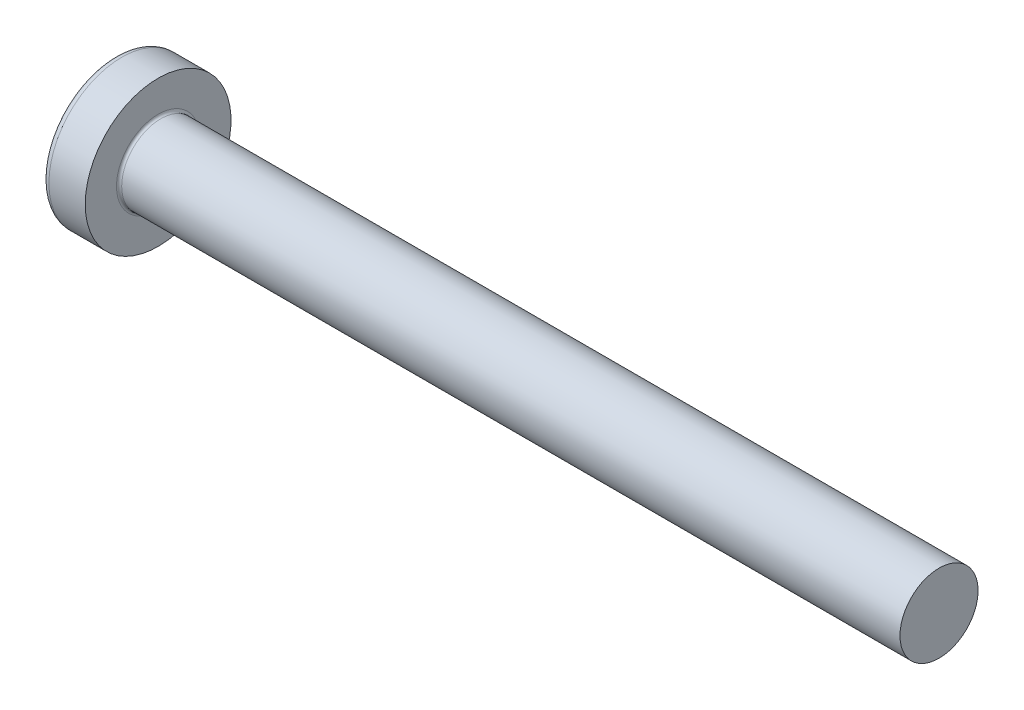
ISO-10303-21;
HEADER;
FILE_DESCRIPTION(('STEP AP214'),'2;1');
FILE_NAME('part.step','',(''),(''),'','','');
FILE_SCHEMA(('AUTOMOTIVE_DESIGN { 1 0 10303 214 1 1 1 1 }'));
ENDSEC;
DATA;
#1=APPLICATION_CONTEXT('core data for automotive mechanical design processes');
#2=APPLICATION_PROTOCOL_DEFINITION('international standard','automotive_design',2000,#1);
#3=PRODUCT_CONTEXT('',#1,'mechanical');
#4=PRODUCT('Part','Part','',(#3));
#5=PRODUCT_RELATED_PRODUCT_CATEGORY('part','',(#4));
#6=PRODUCT_DEFINITION_FORMATION('','',#4);
#7=PRODUCT_DEFINITION_CONTEXT('part definition',#1,'design');
#8=PRODUCT_DEFINITION('design','',#6,#7);
#9=PRODUCT_DEFINITION_SHAPE('','',#8);
#10=(LENGTH_UNIT() NAMED_UNIT(*) SI_UNIT(.MILLI.,.METRE.));
#11=(NAMED_UNIT(*) PLANE_ANGLE_UNIT() SI_UNIT($,.RADIAN.));
#12=(NAMED_UNIT(*) SI_UNIT($,.STERADIAN.) SOLID_ANGLE_UNIT());
#13=UNCERTAINTY_MEASURE_WITH_UNIT(LENGTH_MEASURE(1.E-05),#10,'distance_accuracy_value','');
#14=(GEOMETRIC_REPRESENTATION_CONTEXT(3) GLOBAL_UNCERTAINTY_ASSIGNED_CONTEXT((#13)) GLOBAL_UNIT_ASSIGNED_CONTEXT((#10,
#11,#12)) REPRESENTATION_CONTEXT('',''));
#15=CARTESIAN_POINT('',(0.,0.,0.));
#16=DIRECTION('',(0.,0.,1.));
#17=DIRECTION('',(1.,0.,0.));
#18=AXIS2_PLACEMENT_3D('',#15,#16,#17);
#19=CARTESIAN_POINT('',(5.,0.,0.));
#20=DIRECTION('',(-1.,0.,0.));
#21=DIRECTION('',(0.,1.,0.));
#22=AXIS2_PLACEMENT_3D('',#19,#20,#21);
#23=SPHERICAL_SURFACE('',#22,5.);
#24=CARTESIAN_POINT('',(0.775371598933733,0.,0.));
#25=DIRECTION('',(-1.,0.,0.));
#26=DIRECTION('',(0.,0.,1.));
#27=AXIS2_PLACEMENT_3D('',#24,#25,#26);
#28=CIRCLE('',#27,2.67441860465116);
#29=CARTESIAN_POINT('',(0.775371598933733,0.,2.67441860465116));
#30=VERTEX_POINT('',#29);
#31=EDGE_CURVE('E238',#30,#30,#28,.T.);
#32=ORIENTED_EDGE('',*,*,#31,.T.);
#33=EDGE_LOOP('',(#32));
#34=FACE_BOUND('',#33,.T.);
#35=CARTESIAN_POINT('',(0.0457951200896417,0.,0.));
#36=DIRECTION('',(1.,0.,0.));
#37=DIRECTION('',(0.,0.,-1.));
#38=AXIS2_PLACEMENT_3D('',#35,#36,#37);
#39=CIRCLE('',#38,0.675169614150692);
#40=CARTESIAN_POINT('',(0.0457951200896426,-0.369999999999998,-0.564760133040918));
#41=VERTEX_POINT('',#40);
#42=CARTESIAN_POINT('',(0.0457951200896417,-0.564760133040915,-0.37));
#43=VERTEX_POINT('',#42);
#44=EDGE_CURVE('E374',#41,#43,#39,.F.);
#45=ORIENTED_EDGE('',*,*,#44,.F.);
#46=CARTESIAN_POINT('',(5.,-0.37,0.));
#47=DIRECTION('',(0.,1.,0.));
#48=DIRECTION('',(0.,0.,1.));
#49=AXIS2_PLACEMENT_3D('',#46,#47,#48);
#50=CIRCLE('',#49,4.98629120689917);
#51=CARTESIAN_POINT('',(0.187869734228639,-0.369999999999995,-1.30633162146802));
#52=VERTEX_POINT('',#51);
#53=EDGE_CURVE('E300',#52,#41,#50,.T.);
#54=ORIENTED_EDGE('',*,*,#53,.F.);
#55=CARTESIAN_POINT('',(4.56358262530798,0.,0.875317983305919));
#56=DIRECTION('',(0.446197753347436,0.,-0.894934391398443));
#57=DIRECTION('',(-0.894934391398443,0.,-0.446197753347436));
#58=AXIS2_PLACEMENT_3D('',#55,#56,#57);
#59=CIRCLE('',#58,4.90340272700175);
#60=CARTESIAN_POINT('',(0.18786973422864,0.370000000000005,-1.30633162146802));
#61=VERTEX_POINT('',#60);
#62=EDGE_CURVE('E272',#52,#61,#59,.T.);
#63=ORIENTED_EDGE('',*,*,#62,.T.);
#64=CARTESIAN_POINT('',(5.,0.37,0.));
#65=DIRECTION('',(0.,-1.,0.));
#66=DIRECTION('',(0.,0.,-1.));
#67=AXIS2_PLACEMENT_3D('',#64,#65,#66);
#68=CIRCLE('',#67,4.98629120689917);
#69=CARTESIAN_POINT('',(0.0457951200896425,0.370000000000002,-0.564760133040916));
#70=VERTEX_POINT('',#69);
#71=EDGE_CURVE('E327',#70,#61,#68,.T.);
#72=ORIENTED_EDGE('',*,*,#71,.F.);
#73=CARTESIAN_POINT('',(0.0457951200896417,0.564760133040916,-0.37));
#74=VERTEX_POINT('',#73);
#75=EDGE_CURVE('E393',#74,#70,#39,.F.);
#76=ORIENTED_EDGE('',*,*,#75,.F.);
#77=CARTESIAN_POINT('',(5.,0.,-0.37));
#78=DIRECTION('',(0.,0.,1.));
#79=DIRECTION('',(1.,0.,0.));
#80=AXIS2_PLACEMENT_3D('',#77,#78,#79);
#81=CIRCLE('',#80,4.98629120689917);
#82=CARTESIAN_POINT('',(0.18786973422864,1.30633162146802,-0.37));
#83=VERTEX_POINT('',#82);
#84=EDGE_CURVE('E266',#83,#74,#81,.T.);
#85=ORIENTED_EDGE('',*,*,#84,.F.);
#86=CARTESIAN_POINT('',(4.56358262530798,-0.87531798330592,0.));
#87=DIRECTION('',(0.446197753347436,0.894934391398443,0.));
#88=DIRECTION('',(-0.894934391398442,0.446197753347436,0.));
#89=AXIS2_PLACEMENT_3D('',#86,#87,#88);
#90=CIRCLE('',#89,4.90340272700175);
#91=CARTESIAN_POINT('',(0.18786973422864,1.30633162146802,0.37));
#92=VERTEX_POINT('',#91);
#93=EDGE_CURVE('E269',#83,#92,#90,.T.);
#94=ORIENTED_EDGE('',*,*,#93,.T.);
#95=CARTESIAN_POINT('',(5.,0.,0.37));
#96=DIRECTION('',(0.,0.,-1.));
#97=DIRECTION('',(0.,1.,0.));
#98=AXIS2_PLACEMENT_3D('',#95,#96,#97);
#99=CIRCLE('',#98,4.98629120689917);
#100=CARTESIAN_POINT('',(0.0457951200896417,0.564760133040916,0.37));
#101=VERTEX_POINT('',#100);
#102=EDGE_CURVE('E262',#101,#92,#99,.T.);
#103=ORIENTED_EDGE('',*,*,#102,.F.);
#104=CARTESIAN_POINT('',(0.0457951200896434,0.369999999999998,0.564760133040918));
#105=VERTEX_POINT('',#104);
#106=EDGE_CURVE('E392',#105,#101,#39,.F.);
#107=ORIENTED_EDGE('',*,*,#106,.F.);
#108=CARTESIAN_POINT('',(0.18786973422864,0.369999999999995,1.30633162146802));
#109=VERTEX_POINT('',#108);
#110=EDGE_CURVE('E282',#109,#105,#68,.T.);
#111=ORIENTED_EDGE('',*,*,#110,.F.);
#112=CARTESIAN_POINT('',(4.56358262530798,0.,-0.87531798330592));
#113=DIRECTION('',(0.446197753347436,0.,0.894934391398443));
#114=DIRECTION('',(0.894934391398442,0.,-0.446197753347436));
#115=AXIS2_PLACEMENT_3D('',#112,#113,#114);
#116=CIRCLE('',#115,4.90340272700175);
#117=CARTESIAN_POINT('',(0.18786973422864,-0.370000000000005,1.30633162146802));
#118=VERTEX_POINT('',#117);
#119=EDGE_CURVE('E49',#109,#118,#116,.T.);
#120=ORIENTED_EDGE('',*,*,#119,.T.);
#121=CARTESIAN_POINT('',(0.0457951200896421,-0.370000000000002,0.564760133040916));
#122=VERTEX_POINT('',#121);
#123=EDGE_CURVE('E279',#122,#118,#50,.T.);
#124=ORIENTED_EDGE('',*,*,#123,.F.);
#125=CARTESIAN_POINT('',(0.0457951200896417,-0.564760133040916,0.37));
#126=VERTEX_POINT('',#125);
#127=EDGE_CURVE('E432',#126,#122,#39,.F.);
#128=ORIENTED_EDGE('',*,*,#127,.F.);
#129=CARTESIAN_POINT('',(0.187869734228639,-1.30633162146802,0.37));
#130=VERTEX_POINT('',#129);
#131=EDGE_CURVE('E263',#130,#126,#99,.T.);
#132=ORIENTED_EDGE('',*,*,#131,.F.);
#133=CARTESIAN_POINT('',(4.56358262530798,0.875317983305919,0.));
#134=DIRECTION('',(0.446197753347436,-0.894934391398443,0.));
#135=DIRECTION('',(0.894934391398443,0.446197753347436,0.));
#136=AXIS2_PLACEMENT_3D('',#133,#134,#135);
#137=CIRCLE('',#136,4.90340272700175);
#138=CARTESIAN_POINT('',(0.18786973422864,-1.30633162146802,-0.37));
#139=VERTEX_POINT('',#138);
#140=EDGE_CURVE('E259',#130,#139,#137,.T.);
#141=ORIENTED_EDGE('',*,*,#140,.T.);
#142=EDGE_CURVE('E64',#43,#139,#81,.T.);
#143=ORIENTED_EDGE('',*,*,#142,.F.);
#144=EDGE_LOOP('',(#45,#54,#63,#72,#76,#85,#94,#103,#107,#111,#120,#124,#128,#132,#141,#143));
#145=FACE_BOUND('',#144,.T.);
#146=ADVANCED_FACE('F35',(#34,#145),#23,.T.);
#147=CARTESIAN_POINT('',(1.75,0.527482331818931,-0.37));
#148=DIRECTION('',(0.,0.,1.));
#149=DIRECTION('',(1.,0.,0.));
#150=AXIS2_PLACEMENT_3D('',#147,#148,#149);
#151=PLANE('',#150);
#152=ORIENTED_EDGE('',*,*,#84,.T.);
#153=CARTESIAN_POINT('',(-0.987293237053716,0.649401255967161,-0.37));
#154=CARTESIAN_POINT('',(-0.781914975317084,0.632865887002871,-0.37));
#155=CARTESIAN_POINT('',(-0.576547882393372,0.616188977635081,-0.37));
#156=CARTESIAN_POINT('',(-0.165841599226327,0.582441031964227,-0.37));
#157=CARTESIAN_POINT('',(0.0394975903090452,0.56536998705488,-0.37));
#158=CARTESIAN_POINT('',(0.450133475422572,0.530723441326535,-0.37));
#159=CARTESIAN_POINT('',(0.655430171010573,0.513147940624557,-0.37));
#160=CARTESIAN_POINT('',(1.06596140177934,0.477314957985794,-0.37));
#161=CARTESIAN_POINT('',(1.2711959378071,0.459057485806066,-0.37));
#162=CARTESIAN_POINT('',(1.61065292365626,0.428051938688768,-0.37));
#163=CARTESIAN_POINT('',(1.74490059995643,0.415580824990931,-0.37));
#164=CARTESIAN_POINT('',(2.01334321762763,0.390092023404979,-0.37));
#165=CARTESIAN_POINT('',(2.14753815934577,0.377074339177353,-0.37));
#166=CARTESIAN_POINT('',(2.41586354151957,0.350315629452843,-0.37));
#167=CARTESIAN_POINT('',(2.5499939784531,0.33657456817765,-0.37));
#168=CARTESIAN_POINT('',(2.81814173295471,0.308004077741875,-0.37));
#169=CARTESIAN_POINT('',(2.95215904765134,0.293174621747065,-0.37));
#170=CARTESIAN_POINT('',(3.0860955068368,0.277618485071816,-0.37));
#171=B_SPLINE_CURVE_WITH_KNOTS('',3,(#153,#154,#155,#156,#157,#158,#159,#160,#161,#162,#163,
#164,#165,#166,#167,#168,#169,#170),.UNSPECIFIED.,.F.,.F.,(4,2,2,2,2,2,2,2,4),(0.,
0.618128793984691,1.23627109812525,1.85441325887562,2.4725465791681,2.87702276218609,
3.28149623678161,3.68598973550942,4.09049321032311),.UNSPECIFIED.);
#172=CARTESIAN_POINT('',(1.75,0.415013252800437,-0.37));
#173=VERTEX_POINT('',#172);
#174=EDGE_CURVE('E416',#74,#173,#171,.T.);
#175=ORIENTED_EDGE('',*,*,#174,.T.);
#176=DIRECTION('',(0.,1.,0.));
#177=VECTOR('',#176,1.);
#178=CARTESIAN_POINT('',(1.75,-0.527482331818931,-0.37));
#179=LINE('',#178,#177);
#180=CARTESIAN_POINT('',(1.75,0.527482331818931,-0.37));
#181=VERTEX_POINT('',#180);
#182=EDGE_CURVE('E356',#173,#181,#179,.T.);
#183=ORIENTED_EDGE('',*,*,#182,.T.);
#184=DIRECTION('',(0.894934391398442,-0.446197753347436,0.));
#185=VECTOR('',#184,1.);
#186=CARTESIAN_POINT('',(0.,1.4,-0.37));
#187=LINE('',#186,#185);
#188=EDGE_CURVE('E239',#83,#181,#187,.T.);
#189=ORIENTED_EDGE('',*,*,#188,.F.);
#190=EDGE_LOOP('',(#152,#175,#183,#189));
#191=FACE_BOUND('',#190,.T.);
#192=ADVANCED_FACE('F194',(#191),#151,.T.);
#193=CARTESIAN_POINT('',(1.75,-0.527482331818931,-0.37));
#194=VERTEX_POINT('',#193);
#195=CARTESIAN_POINT('',(1.75,-0.415013252800437,-0.37));
#196=VERTEX_POINT('',#195);
#197=EDGE_CURVE('E247',#194,#196,#179,.T.);
#198=ORIENTED_EDGE('',*,*,#197,.T.);
#199=CARTESIAN_POINT('',(-0.987293237053716,-0.649401255967161,-0.37));
#200=CARTESIAN_POINT('',(-0.781914975317084,-0.632865887002871,-0.37));
#201=CARTESIAN_POINT('',(-0.576547882393372,-0.616188977635081,-0.37));
#202=CARTESIAN_POINT('',(-0.165841599226327,-0.582441031964227,-0.37));
#203=CARTESIAN_POINT('',(0.0394975903090452,-0.56536998705488,-0.37));
#204=CARTESIAN_POINT('',(0.450133475422572,-0.530723441326535,-0.37));
#205=CARTESIAN_POINT('',(0.655430171010573,-0.513147940624557,-0.37));
#206=CARTESIAN_POINT('',(1.06596140177934,-0.477314957985794,-0.37));
#207=CARTESIAN_POINT('',(1.2711959378071,-0.459057485806066,-0.37));
#208=CARTESIAN_POINT('',(1.61065292365626,-0.428051938688768,-0.37));
#209=CARTESIAN_POINT('',(1.74490059995643,-0.415580824990931,-0.37));
#210=CARTESIAN_POINT('',(2.01334321762763,-0.390092023404979,-0.37));
#211=CARTESIAN_POINT('',(2.14753815934577,-0.377074339177353,-0.37));
#212=CARTESIAN_POINT('',(2.41586354151957,-0.350315629452843,-0.37));
#213=CARTESIAN_POINT('',(2.5499939784531,-0.33657456817765,-0.37));
#214=CARTESIAN_POINT('',(2.81814173295471,-0.308004077741875,-0.37));
#215=CARTESIAN_POINT('',(2.95215904765134,-0.293174621747065,-0.37));
#216=CARTESIAN_POINT('',(3.0860955068368,-0.277618485071816,-0.37));
#217=B_SPLINE_CURVE_WITH_KNOTS('',3,(#199,#200,#201,#202,#203,#204,#205,#206,#207,#208,#209,
#210,#211,#212,#213,#214,#215,#216),.UNSPECIFIED.,.F.,.F.,(4,2,2,2,2,2,2,2,4),(0.,
0.618128793984691,1.23627109812525,1.85441325887562,2.4725465791681,2.87702276218609,
3.28149623678161,3.68598973550942,4.09049321032311),.UNSPECIFIED.);
#218=EDGE_CURVE('E391',#196,#43,#217,.F.);
#219=ORIENTED_EDGE('',*,*,#218,.T.);
#220=ORIENTED_EDGE('',*,*,#142,.T.);
#221=DIRECTION('',(0.894934391398442,0.446197753347436,0.));
#222=VECTOR('',#221,1.);
#223=CARTESIAN_POINT('',(0.,-1.4,-0.37));
#224=LINE('',#223,#222);
#225=EDGE_CURVE('E330',#139,#194,#224,.T.);
#226=ORIENTED_EDGE('',*,*,#225,.T.);
#227=EDGE_LOOP('',(#198,#219,#220,#226));
#228=FACE_BOUND('',#227,.T.);
#229=ADVANCED_FACE('F200',(#228),#151,.T.);
#230=CARTESIAN_POINT('',(1.75,-0.527482331818931,0.37));
#231=DIRECTION('',(0.,0.,-1.));
#232=DIRECTION('',(0.,1.,0.));
#233=AXIS2_PLACEMENT_3D('',#230,#231,#232);
#234=PLANE('',#233);
#235=DIRECTION('',(0.,-1.,0.));
#236=VECTOR('',#235,1.);
#237=CARTESIAN_POINT('',(1.75,0.527482331818931,0.37));
#238=LINE('',#237,#236);
#239=CARTESIAN_POINT('',(1.75,0.527482331818931,0.37));
#240=VERTEX_POINT('',#239);
#241=CARTESIAN_POINT('',(1.75,0.415013252800437,0.37));
#242=VERTEX_POINT('',#241);
#243=EDGE_CURVE('E339',#240,#242,#238,.T.);
#244=ORIENTED_EDGE('',*,*,#243,.T.);
#245=CARTESIAN_POINT('',(-0.987293237069635,0.649401255968442,0.37));
#246=CARTESIAN_POINT('',(-0.781914975331301,0.632865887004023,0.37));
#247=CARTESIAN_POINT('',(-0.576547882405888,0.616188977636102,0.37));
#248=CARTESIAN_POINT('',(-0.16584159923544,0.582441031964983,0.37));
#249=CARTESIAN_POINT('',(0.0394975903016338,0.5653699870555,0.37));
#250=CARTESIAN_POINT('',(0.450133475420601,0.530723441326706,0.37));
#251=CARTESIAN_POINT('',(0.655430171012341,0.513147940624409,0.37));
#252=CARTESIAN_POINT('',(1.06596140178858,0.477314957984981,0.37));
#253=CARTESIAN_POINT('',(1.27119593782008,0.459057485804908,0.37));
#254=CARTESIAN_POINT('',(1.61065292367297,0.428051938687225,0.37));
#255=CARTESIAN_POINT('',(1.74490059997313,0.415580824989367,0.37));
#256=CARTESIAN_POINT('',(2.01334321764434,0.39009202340337,0.37));
#257=CARTESIAN_POINT('',(2.14753815936247,0.377074339175718,0.37));
#258=CARTESIAN_POINT('',(2.41586354153627,0.350315629451146,0.37));
#259=CARTESIAN_POINT('',(2.54999397846979,0.336574568175918,0.37));
#260=CARTESIAN_POINT('',(2.8181417329714,0.308004077740054,0.37));
#261=CARTESIAN_POINT('',(2.95215904766802,0.29317462174519,0.37));
#262=CARTESIAN_POINT('',(3.08609550685347,0.277618485069873,0.37));
#263=B_SPLINE_CURVE_WITH_KNOTS('',3,(#245,#246,#247,#248,#249,#250,#251,#252,#253,#254,#255,
#256,#257,#258,#259,#260,#261,#262),.UNSPECIFIED.,.F.,.F.,(4,2,2,2,2,2,2,2,4),(0.,
0.61812879398981,1.23627109813549,1.85441325889711,2.47254657920086,2.87702276221884,
3.28149623681436,3.68598973554218,4.09049321035586),.UNSPECIFIED.);
#264=EDGE_CURVE('E671',#242,#101,#263,.F.);
#265=ORIENTED_EDGE('',*,*,#264,.T.);
#266=ORIENTED_EDGE('',*,*,#102,.T.);
#267=DIRECTION('',(0.894934391398442,-0.446197753347436,0.));
#268=VECTOR('',#267,1.);
#269=CARTESIAN_POINT('',(0.,1.4,0.37));
#270=LINE('',#269,#268);
#271=EDGE_CURVE('E244',#92,#240,#270,.T.);
#272=ORIENTED_EDGE('',*,*,#271,.T.);
#273=EDGE_LOOP('',(#244,#265,#266,#272));
#274=FACE_BOUND('',#273,.T.);
#275=ADVANCED_FACE('F412',(#274),#234,.T.);
#276=ORIENTED_EDGE('',*,*,#131,.T.);
#277=CARTESIAN_POINT('',(-0.987293237069635,-0.649401255968442,0.37));
#278=CARTESIAN_POINT('',(-0.781914975331301,-0.632865887004023,0.37));
#279=CARTESIAN_POINT('',(-0.576547882405888,-0.616188977636102,0.37));
#280=CARTESIAN_POINT('',(-0.16584159923544,-0.582441031964983,0.37));
#281=CARTESIAN_POINT('',(0.0394975903016338,-0.5653699870555,0.37));
#282=CARTESIAN_POINT('',(0.450133475420601,-0.530723441326706,0.37));
#283=CARTESIAN_POINT('',(0.655430171012341,-0.513147940624409,0.37));
#284=CARTESIAN_POINT('',(1.06596140178858,-0.477314957984981,0.37));
#285=CARTESIAN_POINT('',(1.27119593782008,-0.459057485804908,0.37));
#286=CARTESIAN_POINT('',(1.61065292367297,-0.428051938687225,0.37));
#287=CARTESIAN_POINT('',(1.74490059997313,-0.415580824989367,0.37));
#288=CARTESIAN_POINT('',(2.01334321764434,-0.390092023403371,0.37));
#289=CARTESIAN_POINT('',(2.14753815936247,-0.377074339175718,0.37));
#290=CARTESIAN_POINT('',(2.41586354153627,-0.350315629451146,0.37));
#291=CARTESIAN_POINT('',(2.54999397846979,-0.336574568175918,0.37));
#292=CARTESIAN_POINT('',(2.8181417329714,-0.308004077740054,0.37));
#293=CARTESIAN_POINT('',(2.95215904766802,-0.29317462174519,0.37));
#294=CARTESIAN_POINT('',(3.08609550685347,-0.277618485069873,0.37));
#295=B_SPLINE_CURVE_WITH_KNOTS('',3,(#277,#278,#279,#280,#281,#282,#283,#284,#285,#286,#287,
#288,#289,#290,#291,#292,#293,#294),.UNSPECIFIED.,.F.,.F.,(4,2,2,2,2,2,2,2,4),(0.,
0.61812879398981,1.23627109813549,1.85441325889711,2.47254657920086,2.87702276221884,
3.28149623681436,3.68598973554218,4.09049321035586),.UNSPECIFIED.);
#296=CARTESIAN_POINT('',(1.75,-0.415013252800437,0.37));
#297=VERTEX_POINT('',#296);
#298=EDGE_CURVE('E433',#126,#297,#295,.T.);
#299=ORIENTED_EDGE('',*,*,#298,.T.);
#300=CARTESIAN_POINT('',(1.75,-0.527482331818932,0.37));
#301=VERTEX_POINT('',#300);
#302=EDGE_CURVE('E341',#297,#301,#238,.T.);
#303=ORIENTED_EDGE('',*,*,#302,.T.);
#304=DIRECTION('',(0.894934391398443,0.446197753347436,0.));
#305=VECTOR('',#304,1.);
#306=CARTESIAN_POINT('',(0.,-1.4,0.37));
#307=LINE('',#306,#305);
#308=EDGE_CURVE('E332',#130,#301,#307,.T.);
#309=ORIENTED_EDGE('',*,*,#308,.F.);
#310=EDGE_LOOP('',(#276,#299,#303,#309));
#311=FACE_BOUND('',#310,.T.);
#312=ADVANCED_FACE('F519',(#311),#234,.T.);
#313=CARTESIAN_POINT('',(1.75,0.527482331818931,0.37));
#314=DIRECTION('',(0.446197753347436,0.894934391398443,0.));
#315=DIRECTION('',(-0.894934391398442,0.446197753347436,0.));
#316=AXIS2_PLACEMENT_3D('',#313,#314,#315);
#317=PLANE('',#316);
#318=CARTESIAN_POINT('',(2.6696526882832,0.0689604923233249,0.));
#319=DIRECTION('',(0.446197753347436,0.894934391398443,0.));
#320=DIRECTION('',(-0.894934391398443,0.446197753347436,0.));
#321=AXIS2_PLACEMENT_3D('',#318,#319,#320);
#322=ELLIPSE('',#321,1.10195897609154,0.486831694838766);
#323=CARTESIAN_POINT('',(1.75,0.527482331818932,0.175779377683682));
#324=VERTEX_POINT('',#323);
#325=CARTESIAN_POINT('',(1.75,0.527482331818932,-0.175779377683682));
#326=VERTEX_POINT('',#325);
#327=EDGE_CURVE('E305',#324,#326,#322,.F.);
#328=ORIENTED_EDGE('',*,*,#327,.F.);
#329=DIRECTION('',(0.,0.,-1.));
#330=VECTOR('',#329,1.);
#331=CARTESIAN_POINT('',(1.75,0.527482331818931,0.37));
#332=LINE('',#331,#330);
#333=EDGE_CURVE('E342',#240,#324,#332,.T.);
#334=ORIENTED_EDGE('',*,*,#333,.F.);
#335=ORIENTED_EDGE('',*,*,#271,.F.);
#336=ORIENTED_EDGE('',*,*,#93,.F.);
#337=ORIENTED_EDGE('',*,*,#188,.T.);
#338=EDGE_CURVE('E344',#326,#181,#332,.T.);
#339=ORIENTED_EDGE('',*,*,#338,.F.);
#340=EDGE_LOOP('',(#328,#334,#335,#336,#337,#339));
#341=FACE_BOUND('',#340,.T.);
#342=ADVANCED_FACE('F410',(#341),#317,.F.);
#343=CARTESIAN_POINT('',(0.,-1.4,-0.37));
#344=DIRECTION('',(0.446197753347436,-0.894934391398443,0.));
#345=DIRECTION('',(0.894934391398443,0.446197753347436,0.));
#346=AXIS2_PLACEMENT_3D('',#343,#344,#345);
#347=PLANE('',#346);
#348=CARTESIAN_POINT('',(2.6696526882832,-0.0689604923233252,0.));
#349=DIRECTION('',(0.446197753347436,-0.894934391398443,0.));
#350=DIRECTION('',(-0.894934391398443,-0.446197753347436,0.));
#351=AXIS2_PLACEMENT_3D('',#348,#349,#350);
#352=ELLIPSE('',#351,1.10195897609154,0.486831694838766);
#353=CARTESIAN_POINT('',(1.75,-0.527482331818932,-0.175779377683681));
#354=VERTEX_POINT('',#353);
#355=CARTESIAN_POINT('',(1.75,-0.527482331818932,0.175779377683681));
#356=VERTEX_POINT('',#355);
#357=EDGE_CURVE('E673',#354,#356,#352,.F.);
#358=ORIENTED_EDGE('',*,*,#357,.F.);
#359=DIRECTION('',(0.,0.,1.));
#360=VECTOR('',#359,1.);
#361=CARTESIAN_POINT('',(1.75,-0.527482331818931,-0.37));
#362=LINE('',#361,#360);
#363=EDGE_CURVE('E335',#194,#354,#362,.T.);
#364=ORIENTED_EDGE('',*,*,#363,.F.);
#365=ORIENTED_EDGE('',*,*,#225,.F.);
#366=ORIENTED_EDGE('',*,*,#140,.F.);
#367=ORIENTED_EDGE('',*,*,#308,.T.);
#368=EDGE_CURVE('E338',#356,#301,#362,.T.);
#369=ORIENTED_EDGE('',*,*,#368,.F.);
#370=EDGE_LOOP('',(#358,#364,#365,#366,#367,#369));
#371=FACE_BOUND('',#370,.T.);
#372=ADVANCED_FACE('F506',(#371),#347,.F.);
#373=CARTESIAN_POINT('',(1.75,0.527482331818931,-0.37));
#374=DIRECTION('',(-1.,0.,0.));
#375=DIRECTION('',(0.,0.,1.));
#376=AXIS2_PLACEMENT_3D('',#373,#374,#375);
#377=PLANE('',#376);
#378=DIRECTION('',(0.,1.,0.));
#379=VECTOR('',#378,1.);
#380=CARTESIAN_POINT('',(1.75,-0.370000000000002,0.52748233181893));
#381=LINE('',#380,#379);
#382=CARTESIAN_POINT('',(1.75,-0.370000000000002,0.52748233181893));
#383=VERTEX_POINT('',#382);
#384=CARTESIAN_POINT('',(1.75,-0.175779377683686,0.52748233181893));
#385=VERTEX_POINT('',#384);
#386=EDGE_CURVE('E320',#383,#385,#381,.T.);
#387=ORIENTED_EDGE('',*,*,#386,.T.);
#388=CARTESIAN_POINT('',(1.75,0.,0.));
#389=DIRECTION('',(-1.,0.,0.));
#390=DIRECTION('',(0.,0.,1.));
#391=AXIS2_PLACEMENT_3D('',#388,#389,#390);
#392=CIRCLE('',#391,0.556);
#393=CARTESIAN_POINT('',(1.75,-0.370000000000001,0.415013252800436));
#394=VERTEX_POINT('',#393);
#395=EDGE_CURVE('E701',#394,#385,#392,.T.);
#396=ORIENTED_EDGE('',*,*,#395,.F.);
#397=DIRECTION('',(0.,0.,-1.));
#398=VECTOR('',#397,1.);
#399=CARTESIAN_POINT('',(1.75,-0.370000000000002,0.52748233181893));
#400=LINE('',#399,#398);
#401=EDGE_CURVE('E316',#383,#394,#400,.T.);
#402=ORIENTED_EDGE('',*,*,#401,.F.);
#403=EDGE_LOOP('',(#387,#396,#402));
#404=FACE_BOUND('',#403,.T.);
#405=ADVANCED_FACE('F499',(#404),#377,.T.);
#406=ORIENTED_EDGE('',*,*,#302,.F.);
#407=EDGE_CURVE('E706',#356,#297,#392,.T.);
#408=ORIENTED_EDGE('',*,*,#407,.F.);
#409=ORIENTED_EDGE('',*,*,#368,.T.);
#410=EDGE_LOOP('',(#406,#408,#409));
#411=FACE_BOUND('',#410,.T.);
#412=ADVANCED_FACE('F492',(#411),#377,.T.);
#413=ORIENTED_EDGE('',*,*,#363,.T.);
#414=EDGE_CURVE('E385',#196,#354,#392,.T.);
#415=ORIENTED_EDGE('',*,*,#414,.F.);
#416=ORIENTED_EDGE('',*,*,#197,.F.);
#417=EDGE_LOOP('',(#413,#415,#416));
#418=FACE_BOUND('',#417,.T.);
#419=ADVANCED_FACE('F486',(#418),#377,.T.);
#420=CARTESIAN_POINT('',(1.75,-0.369999999999998,-0.415013252800438));
#421=VERTEX_POINT('',#420);
#422=CARTESIAN_POINT('',(1.75,-0.369999999999998,-0.527482331818933));
#423=VERTEX_POINT('',#422);
#424=EDGE_CURVE('E319',#421,#423,#400,.T.);
#425=ORIENTED_EDGE('',*,*,#424,.F.);
#426=CARTESIAN_POINT('',(1.75,-0.17577937768368,-0.527482331818932));
#427=VERTEX_POINT('',#426);
#428=EDGE_CURVE('E56',#427,#421,#392,.T.);
#429=ORIENTED_EDGE('',*,*,#428,.F.);
#430=DIRECTION('',(0.,-1.,0.));
#431=VECTOR('',#430,1.);
#432=CARTESIAN_POINT('',(1.75,0.370000000000002,-0.52748233181893));
#433=LINE('',#432,#431);
#434=EDGE_CURVE('E315',#427,#423,#433,.T.);
#435=ORIENTED_EDGE('',*,*,#434,.T.);
#436=EDGE_LOOP('',(#425,#429,#435));
#437=FACE_BOUND('',#436,.T.);
#438=ADVANCED_FACE('F380',(#437),#377,.T.);
#439=CARTESIAN_POINT('',(1.75,0.370000000000002,-0.52748233181893));
#440=VERTEX_POINT('',#439);
#441=CARTESIAN_POINT('',(1.75,0.175779377683684,-0.527482331818931));
#442=VERTEX_POINT('',#441);
#443=EDGE_CURVE('E312',#440,#442,#433,.T.);
#444=ORIENTED_EDGE('',*,*,#443,.T.);
#445=CARTESIAN_POINT('',(1.75,0.370000000000001,-0.415013252800436));
#446=VERTEX_POINT('',#445);
#447=EDGE_CURVE('E384',#446,#442,#392,.T.);
#448=ORIENTED_EDGE('',*,*,#447,.F.);
#449=DIRECTION('',(0.,0.,1.));
#450=VECTOR('',#449,1.);
#451=CARTESIAN_POINT('',(1.75,0.370000000000002,-0.52748233181893));
#452=LINE('',#451,#450);
#453=EDGE_CURVE('E324',#440,#446,#452,.T.);
#454=ORIENTED_EDGE('',*,*,#453,.F.);
#455=EDGE_LOOP('',(#444,#448,#454));
#456=FACE_BOUND('',#455,.T.);
#457=ADVANCED_FACE('F474',(#456),#377,.T.);
#458=ORIENTED_EDGE('',*,*,#182,.F.);
#459=EDGE_CURVE('E690',#326,#173,#392,.T.);
#460=ORIENTED_EDGE('',*,*,#459,.F.);
#461=ORIENTED_EDGE('',*,*,#338,.T.);
#462=EDGE_LOOP('',(#458,#460,#461));
#463=FACE_BOUND('',#462,.T.);
#464=ADVANCED_FACE('F467',(#463),#377,.T.);
#465=ORIENTED_EDGE('',*,*,#333,.T.);
#466=EDGE_CURVE('E692',#242,#324,#392,.T.);
#467=ORIENTED_EDGE('',*,*,#466,.F.);
#468=ORIENTED_EDGE('',*,*,#243,.F.);
#469=EDGE_LOOP('',(#465,#467,#468));
#470=FACE_BOUND('',#469,.T.);
#471=ADVANCED_FACE('F461',(#470),#377,.T.);
#472=CARTESIAN_POINT('',(1.75,0.369999999999998,0.527482331818932));
#473=DIRECTION('',(0.,-1.,0.));
#474=DIRECTION('',(1.,0.,0.));
#475=AXIS2_PLACEMENT_3D('',#472,#473,#474);
#476=PLANE('',#475);
#477=ORIENTED_EDGE('',*,*,#110,.T.);
#478=CARTESIAN_POINT('',(-0.987293237069635,0.369999999999998,0.649401255968443));
#479=CARTESIAN_POINT('',(-0.781914975331301,0.369999999999998,0.632865887004024));
#480=CARTESIAN_POINT('',(-0.576547882405888,0.369999999999998,0.616188977636103));
#481=CARTESIAN_POINT('',(-0.16584159923544,0.369999999999998,0.582441031964984));
#482=CARTESIAN_POINT('',(0.0394975903016338,0.369999999999998,0.565369987055501));
#483=CARTESIAN_POINT('',(0.450133475420601,0.369999999999998,0.530723441326707));
#484=CARTESIAN_POINT('',(0.655430171012341,0.369999999999998,0.51314794062441));
#485=CARTESIAN_POINT('',(1.06596140178858,0.369999999999998,0.477314957984982));
#486=CARTESIAN_POINT('',(1.27119593782008,0.369999999999998,0.459057485804909));
#487=CARTESIAN_POINT('',(1.61065292367297,0.369999999999999,0.428051938687226));
#488=CARTESIAN_POINT('',(1.74490059997313,0.369999999999999,0.415580824989369));
#489=CARTESIAN_POINT('',(2.01334321764434,0.369999999999999,0.390092023403372));
#490=CARTESIAN_POINT('',(2.14753815936247,0.369999999999999,0.37707433917572));
#491=CARTESIAN_POINT('',(2.41586354153627,0.369999999999999,0.350315629451147));
#492=CARTESIAN_POINT('',(2.54999397846979,0.369999999999999,0.336574568175919));
#493=CARTESIAN_POINT('',(2.8181417329714,0.369999999999999,0.308004077740055));
#494=CARTESIAN_POINT('',(2.95215904766802,0.369999999999999,0.293174621745191));
#495=CARTESIAN_POINT('',(3.08609550685347,0.369999999999999,0.277618485069875));
#496=B_SPLINE_CURVE_WITH_KNOTS('',3,(#478,#479,#480,#481,#482,#483,#484,#485,#486,#487,#488,
#489,#490,#491,#492,#493,#494,#495),.UNSPECIFIED.,.F.,.F.,(4,2,2,2,2,2,2,2,4),(0.,
0.61812879398981,1.23627109813549,1.85441325889711,2.47254657920086,2.87702276221884,
3.28149623681436,3.68598973554218,4.09049321035586),.UNSPECIFIED.);
#497=CARTESIAN_POINT('',(1.75,0.369999999999999,0.415013252800439));
#498=VERTEX_POINT('',#497);
#499=EDGE_CURVE('E670',#105,#498,#496,.T.);
#500=ORIENTED_EDGE('',*,*,#499,.T.);
#501=CARTESIAN_POINT('',(1.75,0.369999999999998,0.527482331818932));
#502=VERTEX_POINT('',#501);
#503=EDGE_CURVE('E297',#498,#502,#452,.T.);
#504=ORIENTED_EDGE('',*,*,#503,.T.);
#505=DIRECTION('',(0.894934391398442,0.,-0.446197753347436));
#506=VECTOR('',#505,1.);
#507=CARTESIAN_POINT('',(0.,0.369999999999995,1.4));
#508=LINE('',#507,#506);
#509=EDGE_CURVE('E290',#109,#502,#508,.T.);
#510=ORIENTED_EDGE('',*,*,#509,.F.);
#511=EDGE_LOOP('',(#477,#500,#504,#510));
#512=FACE_BOUND('',#511,.T.);
#513=ADVANCED_FACE('F294',(#512),#476,.T.);
#514=CARTESIAN_POINT('',(1.75,-0.369999999999998,-0.527482331818933));
#515=DIRECTION('',(0.,1.,0.));
#516=DIRECTION('',(0.,0.,1.));
#517=AXIS2_PLACEMENT_3D('',#514,#515,#516);
#518=PLANE('',#517);
#519=ORIENTED_EDGE('',*,*,#401,.T.);
#520=CARTESIAN_POINT('',(-0.987293237053716,-0.370000000000002,0.649401255967159));
#521=CARTESIAN_POINT('',(-0.781914975317084,-0.370000000000002,0.63286588700287));
#522=CARTESIAN_POINT('',(-0.576547882393372,-0.370000000000002,0.616188977635079));
#523=CARTESIAN_POINT('',(-0.165841599226327,-0.370000000000002,0.582441031964225));
#524=CARTESIAN_POINT('',(0.039497590309045,-0.370000000000002,0.565369987054878));
#525=CARTESIAN_POINT('',(0.450133475422572,-0.370000000000002,0.530723441326534));
#526=CARTESIAN_POINT('',(0.655430171010573,-0.370000000000002,0.513147940624556));
#527=CARTESIAN_POINT('',(1.06596140177934,-0.370000000000002,0.477314957985792));
#528=CARTESIAN_POINT('',(1.2711959378071,-0.370000000000002,0.459057485806065));
#529=CARTESIAN_POINT('',(1.61065292365626,-0.370000000000001,0.428051938688767));
#530=CARTESIAN_POINT('',(1.74490059995642,-0.370000000000001,0.41558082499093));
#531=CARTESIAN_POINT('',(2.01334321762763,-0.370000000000001,0.390092023404978));
#532=CARTESIAN_POINT('',(2.14753815934577,-0.370000000000001,0.377074339177352));
#533=CARTESIAN_POINT('',(2.41586354151957,-0.370000000000001,0.350315629452841));
#534=CARTESIAN_POINT('',(2.5499939784531,-0.370000000000001,0.336574568177649));
#535=CARTESIAN_POINT('',(2.81814173295471,-0.370000000000001,0.308004077741874));
#536=CARTESIAN_POINT('',(2.95215904765134,-0.370000000000001,0.293174621747064));
#537=CARTESIAN_POINT('',(3.0860955068368,-0.370000000000001,0.277618485071814));
#538=B_SPLINE_CURVE_WITH_KNOTS('',3,(#520,#521,#522,#523,#524,#525,#526,#527,#528,#529,#530,
#531,#532,#533,#534,#535,#536,#537),.UNSPECIFIED.,.F.,.F.,(4,2,2,2,2,2,2,2,4),(0.,
0.618128793984691,1.23627109812525,1.85441325887562,2.4725465791681,2.87702276218609,
3.28149623678161,3.68598973550942,4.09049321032311),.UNSPECIFIED.);
#539=EDGE_CURVE('E425',#394,#122,#538,.F.);
#540=ORIENTED_EDGE('',*,*,#539,.T.);
#541=ORIENTED_EDGE('',*,*,#123,.T.);
#542=DIRECTION('',(0.894934391398442,0.,-0.446197753347436));
#543=VECTOR('',#542,1.);
#544=CARTESIAN_POINT('',(0.,-0.370000000000005,1.4));
#545=LINE('',#544,#543);
#546=EDGE_CURVE('E292',#118,#383,#545,.T.);
#547=ORIENTED_EDGE('',*,*,#546,.T.);
#548=EDGE_LOOP('',(#519,#540,#541,#547));
#549=FACE_BOUND('',#548,.T.);
#550=ADVANCED_FACE('F229',(#549),#518,.T.);
#551=CARTESIAN_POINT('',(1.75,-0.370000000000002,0.52748233181893));
#552=DIRECTION('',(0.446197753347436,0.,0.894934391398443));
#553=DIRECTION('',(-0.894934391398442,0.,0.446197753347436));
#554=AXIS2_PLACEMENT_3D('',#551,#552,#553);
#555=PLANE('',#554);
#556=CARTESIAN_POINT('',(2.6696526882832,0.,0.0689604923233248));
#557=DIRECTION('',(0.446197753347436,0.,0.894934391398443));
#558=DIRECTION('',(-0.894934391398443,0.,0.446197753347436));
#559=AXIS2_PLACEMENT_3D('',#556,#557,#558);
#560=ELLIPSE('',#559,1.10195897609154,0.486831694838766);
#561=CARTESIAN_POINT('',(1.75,0.175779377683682,0.527482331818932));
#562=VERTEX_POINT('',#561);
#563=EDGE_CURVE('E423',#385,#562,#560,.F.);
#564=ORIENTED_EDGE('',*,*,#563,.F.);
#565=ORIENTED_EDGE('',*,*,#386,.F.);
#566=ORIENTED_EDGE('',*,*,#546,.F.);
#567=ORIENTED_EDGE('',*,*,#119,.F.);
#568=ORIENTED_EDGE('',*,*,#509,.T.);
#569=EDGE_CURVE('E323',#562,#502,#381,.T.);
#570=ORIENTED_EDGE('',*,*,#569,.F.);
#571=EDGE_LOOP('',(#564,#565,#566,#567,#568,#570));
#572=FACE_BOUND('',#571,.T.);
#573=ADVANCED_FACE('F288',(#572),#555,.F.);
#574=CARTESIAN_POINT('',(0.,0.370000000000005,-1.4));
#575=DIRECTION('',(0.446197753347436,0.,-0.894934391398443));
#576=DIRECTION('',(0.894934391398443,0.,0.446197753347436));
#577=AXIS2_PLACEMENT_3D('',#574,#575,#576);
#578=PLANE('',#577);
#579=CARTESIAN_POINT('',(2.6696526882832,0.,-0.0689604923233253));
#580=DIRECTION('',(0.446197753347436,0.,-0.894934391398443));
#581=DIRECTION('',(-0.894934391398443,0.,-0.446197753347436));
#582=AXIS2_PLACEMENT_3D('',#579,#580,#581);
#583=ELLIPSE('',#582,1.10195897609154,0.486831694838766);
#584=EDGE_CURVE('E378',#442,#427,#583,.F.);
#585=ORIENTED_EDGE('',*,*,#584,.F.);
#586=ORIENTED_EDGE('',*,*,#443,.F.);
#587=DIRECTION('',(0.894934391398442,0.,0.446197753347436));
#588=VECTOR('',#587,1.);
#589=CARTESIAN_POINT('',(0.,0.370000000000005,-1.4));
#590=LINE('',#589,#588);
#591=EDGE_CURVE('E302',#61,#440,#590,.T.);
#592=ORIENTED_EDGE('',*,*,#591,.F.);
#593=ORIENTED_EDGE('',*,*,#62,.F.);
#594=DIRECTION('',(0.894934391398443,0.,0.446197753347436));
#595=VECTOR('',#594,1.);
#596=CARTESIAN_POINT('',(0.,-0.369999999999995,-1.4));
#597=LINE('',#596,#595);
#598=EDGE_CURVE('E309',#52,#423,#597,.T.);
#599=ORIENTED_EDGE('',*,*,#598,.T.);
#600=ORIENTED_EDGE('',*,*,#434,.F.);
#601=EDGE_LOOP('',(#585,#586,#592,#593,#599,#600));
#602=FACE_BOUND('',#601,.T.);
#603=ADVANCED_FACE('F369',(#602),#578,.F.);
#604=ORIENTED_EDGE('',*,*,#453,.T.);
#605=CARTESIAN_POINT('',(-0.987293237053716,0.370000000000002,-0.649401255967159));
#606=CARTESIAN_POINT('',(-0.781914975317084,0.370000000000002,-0.63286588700287));
#607=CARTESIAN_POINT('',(-0.576547882393372,0.370000000000002,-0.61618897763508));
#608=CARTESIAN_POINT('',(-0.165841599226327,0.370000000000002,-0.582441031964225));
#609=CARTESIAN_POINT('',(0.039497590309045,0.370000000000002,-0.565369987054878));
#610=CARTESIAN_POINT('',(0.450133475422572,0.370000000000002,-0.530723441326533));
#611=CARTESIAN_POINT('',(0.655430171010573,0.370000000000002,-0.513147940624555));
#612=CARTESIAN_POINT('',(1.06596140177934,0.370000000000002,-0.477314957985793));
#613=CARTESIAN_POINT('',(1.2711959378071,0.370000000000002,-0.459057485806065));
#614=CARTESIAN_POINT('',(1.61065292365626,0.370000000000001,-0.428051938688767));
#615=CARTESIAN_POINT('',(1.74490059995642,0.370000000000001,-0.41558082499093));
#616=CARTESIAN_POINT('',(2.01334321762763,0.370000000000001,-0.390092023404978));
#617=CARTESIAN_POINT('',(2.14753815934577,0.370000000000001,-0.377074339177352));
#618=CARTESIAN_POINT('',(2.41586354151957,0.370000000000001,-0.350315629452841));
#619=CARTESIAN_POINT('',(2.5499939784531,0.370000000000001,-0.336574568177649));
#620=CARTESIAN_POINT('',(2.81814173295471,0.370000000000001,-0.308004077741874));
#621=CARTESIAN_POINT('',(2.95215904765134,0.370000000000001,-0.293174621747064));
#622=CARTESIAN_POINT('',(3.0860955068368,0.370000000000001,-0.277618485071814));
#623=B_SPLINE_CURVE_WITH_KNOTS('',3,(#605,#606,#607,#608,#609,#610,#611,#612,#613,#614,#615,
#616,#617,#618,#619,#620,#621,#622),.UNSPECIFIED.,.F.,.F.,(4,2,2,2,2,2,2,2,4),(0.,
0.618128793984691,1.23627109812525,1.85441325887562,2.4725465791681,2.87702276218609,
3.28149623678161,3.68598973550942,4.09049321032311),.UNSPECIFIED.);
#624=EDGE_CURVE('E365',#446,#70,#623,.F.);
#625=ORIENTED_EDGE('',*,*,#624,.T.);
#626=ORIENTED_EDGE('',*,*,#71,.T.);
#627=ORIENTED_EDGE('',*,*,#591,.T.);
#628=EDGE_LOOP('',(#604,#625,#626,#627));
#629=FACE_BOUND('',#628,.T.);
#630=ADVANCED_FACE('F227',(#629),#476,.T.);
#631=ORIENTED_EDGE('',*,*,#53,.T.);
#632=CARTESIAN_POINT('',(-0.987293237053716,-0.369999999999998,-0.649401255967162));
#633=CARTESIAN_POINT('',(-0.781914975317084,-0.369999999999998,-0.632865887002873));
#634=CARTESIAN_POINT('',(-0.576547882393372,-0.369999999999998,-0.616188977635082));
#635=CARTESIAN_POINT('',(-0.165841599226327,-0.369999999999998,-0.582441031964228));
#636=CARTESIAN_POINT('',(0.0394975903090453,-0.369999999999998,-0.565369987054881));
#637=CARTESIAN_POINT('',(0.450133475422572,-0.369999999999998,-0.530723441326536));
#638=CARTESIAN_POINT('',(0.655430171010573,-0.369999999999998,-0.513147940624558));
#639=CARTESIAN_POINT('',(1.06596140177934,-0.369999999999998,-0.477314957985795));
#640=CARTESIAN_POINT('',(1.2711959378071,-0.369999999999998,-0.459057485806067));
#641=CARTESIAN_POINT('',(1.61065292365626,-0.369999999999998,-0.42805193868877));
#642=CARTESIAN_POINT('',(1.74490059995643,-0.369999999999998,-0.415580824990932));
#643=CARTESIAN_POINT('',(2.01334321762763,-0.369999999999999,-0.390092023404981));
#644=CARTESIAN_POINT('',(2.14753815934577,-0.369999999999999,-0.377074339177355));
#645=CARTESIAN_POINT('',(2.41586354151957,-0.369999999999999,-0.350315629452844));
#646=CARTESIAN_POINT('',(2.5499939784531,-0.369999999999999,-0.336574568177652));
#647=CARTESIAN_POINT('',(2.81814173295471,-0.369999999999999,-0.308004077741877));
#648=CARTESIAN_POINT('',(2.95215904765134,-0.369999999999999,-0.293174621747066));
#649=CARTESIAN_POINT('',(3.0860955068368,-0.369999999999999,-0.277618485071817));
#650=B_SPLINE_CURVE_WITH_KNOTS('',3,(#632,#633,#634,#635,#636,#637,#638,#639,#640,#641,#642,
#643,#644,#645,#646,#647,#648,#649),.UNSPECIFIED.,.F.,.F.,(4,2,2,2,2,2,2,2,4),(0.,
0.618128793984691,1.23627109812525,1.85441325887562,2.4725465791681,2.87702276218609,
3.28149623678161,3.68598973550942,4.09049321032311),.UNSPECIFIED.);
#651=EDGE_CURVE('E11',#41,#421,#650,.T.);
#652=ORIENTED_EDGE('',*,*,#651,.T.);
#653=ORIENTED_EDGE('',*,*,#424,.T.);
#654=ORIENTED_EDGE('',*,*,#598,.F.);
#655=EDGE_LOOP('',(#631,#652,#653,#654));
#656=FACE_BOUND('',#655,.T.);
#657=ADVANCED_FACE('F222',(#656),#518,.T.);
#658=CARTESIAN_POINT('',(-25.4,0.,0.));
#659=DIRECTION('',(-1.,0.,0.));
#660=DIRECTION('',(0.,0.,1.));
#661=AXIS2_PLACEMENT_3D('',#658,#659,#660);
#662=CYLINDRICAL_SURFACE('',#661,1.5);
#663=CARTESIAN_POINT('',(2.5,0.,0.));
#664=DIRECTION('',(-1.,0.,0.));
#665=DIRECTION('',(0.,0.,1.));
#666=AXIS2_PLACEMENT_3D('',#663,#664,#665);
#667=CIRCLE('',#666,1.5);
#668=CARTESIAN_POINT('',(2.5,0.,1.5));
#669=VERTEX_POINT('',#668);
#670=EDGE_CURVE('E233',#669,#669,#667,.F.);
#671=ORIENTED_EDGE('',*,*,#670,.T.);
#672=EDGE_LOOP('',(#671));
#673=FACE_BOUND('',#672,.T.);
#674=CARTESIAN_POINT('',(32.4,0.,0.));
#675=DIRECTION('',(-1.,0.,0.));
#676=DIRECTION('',(0.,0.,1.));
#677=AXIS2_PLACEMENT_3D('',#674,#675,#676);
#678=CIRCLE('',#677,1.5);
#679=CARTESIAN_POINT('',(32.4,0.,1.5));
#680=VERTEX_POINT('',#679);
#681=EDGE_CURVE('E236',#680,#680,#678,.T.);
#682=ORIENTED_EDGE('',*,*,#681,.T.);
#683=EDGE_LOOP('',(#682));
#684=FACE_BOUND('',#683,.T.);
#685=ADVANCED_FACE('F219',(#673,#684),#662,.T.);
#686=CARTESIAN_POINT('',(2.4,1.5,0.));
#687=DIRECTION('',(-1.,0.,0.));
#688=DIRECTION('',(0.,0.,1.));
#689=AXIS2_PLACEMENT_3D('',#686,#687,#688);
#690=PLANE('',#689);
#691=CARTESIAN_POINT('',(2.4,0.,0.));
#692=DIRECTION('',(-1.,0.,0.));
#693=DIRECTION('',(0.,0.,1.));
#694=AXIS2_PLACEMENT_3D('',#691,#692,#693);
#695=CIRCLE('',#694,1.6);
#696=CARTESIAN_POINT('',(2.4,0.,1.6));
#697=VERTEX_POINT('',#696);
#698=EDGE_CURVE('E255',#697,#697,#695,.T.);
#699=ORIENTED_EDGE('',*,*,#698,.T.);
#700=EDGE_LOOP('',(#699));
#701=FACE_BOUND('',#700,.T.);
#702=CARTESIAN_POINT('',(2.4,0.,0.));
#703=DIRECTION('',(-1.,0.,0.));
#704=DIRECTION('',(0.,0.,1.));
#705=AXIS2_PLACEMENT_3D('',#702,#703,#704);
#706=CIRCLE('',#705,2.8);
#707=CARTESIAN_POINT('',(2.4,0.,2.8));
#708=VERTEX_POINT('',#707);
#709=EDGE_CURVE('E252',#708,#708,#706,.T.);
#710=ORIENTED_EDGE('',*,*,#709,.F.);
#711=EDGE_LOOP('',(#710));
#712=FACE_BOUND('',#711,.T.);
#713=ADVANCED_FACE('F216',(#701,#712),#690,.F.);
#714=CARTESIAN_POINT('',(-25.4,0.,0.));
#715=DIRECTION('',(-1.,0.,0.));
#716=DIRECTION('',(0.,0.,1.));
#717=AXIS2_PLACEMENT_3D('',#714,#715,#716);
#718=CYLINDRICAL_SURFACE('',#717,2.8);
#719=ORIENTED_EDGE('',*,*,#709,.T.);
#720=EDGE_LOOP('',(#719));
#721=FACE_BOUND('',#720,.T.);
#722=CARTESIAN_POINT('',(1.00350153259131,0.,0.));
#723=DIRECTION('',(-1.,0.,0.));
#724=DIRECTION('',(0.,0.,1.));
#725=AXIS2_PLACEMENT_3D('',#722,#723,#724);
#726=CIRCLE('',#725,2.8);
#727=CARTESIAN_POINT('',(1.00350153259131,0.,2.8));
#728=VERTEX_POINT('',#727);
#729=EDGE_CURVE('E241',#728,#728,#726,.T.);
#730=ORIENTED_EDGE('',*,*,#729,.F.);
#731=EDGE_LOOP('',(#730));
#732=FACE_BOUND('',#731,.T.);
#733=ADVANCED_FACE('F212',(#721,#732),#718,.T.);
#734=CARTESIAN_POINT('',(1.00350153259131,0.,0.));
#735=DIRECTION('',(-1.,0.,0.));
#736=DIRECTION('',(0.,0.,1.));
#737=AXIS2_PLACEMENT_3D('',#734,#735,#736);
#738=TOROIDAL_SURFACE('',#737,2.53,0.27);
#739=ORIENTED_EDGE('',*,*,#729,.T.);
#740=EDGE_LOOP('',(#739));
#741=FACE_BOUND('',#740,.T.);
#742=ORIENTED_EDGE('',*,*,#31,.F.);
#743=EDGE_LOOP('',(#742));
#744=FACE_BOUND('',#743,.T.);
#745=ADVANCED_FACE('F209',(#741,#744),#738,.T.);
#746=CARTESIAN_POINT('',(32.4,1.5,0.));
#747=DIRECTION('',(1.,0.,0.));
#748=DIRECTION('',(0.,0.,-1.));
#749=AXIS2_PLACEMENT_3D('',#746,#747,#748);
#750=PLANE('',#749);
#751=ORIENTED_EDGE('',*,*,#681,.F.);
#752=EDGE_LOOP('',(#751));
#753=FACE_BOUND('',#752,.T.);
#754=ADVANCED_FACE('F207',(#753),#750,.T.);
#755=CARTESIAN_POINT('',(2.5,0.,0.));
#756=DIRECTION('',(-1.,0.,0.));
#757=DIRECTION('',(0.,0.,1.));
#758=AXIS2_PLACEMENT_3D('',#755,#756,#757);
#759=TOROIDAL_SURFACE('',#758,1.6,0.1);
#760=ORIENTED_EDGE('',*,*,#670,.F.);
#761=EDGE_LOOP('',(#760));
#762=FACE_BOUND('',#761,.T.);
#763=ORIENTED_EDGE('',*,*,#698,.F.);
#764=EDGE_LOOP('',(#763));
#765=FACE_BOUND('',#764,.T.);
#766=ADVANCED_FACE('F37',(#762,#765),#759,.F.);
#767=ORIENTED_EDGE('',*,*,#503,.F.);
#768=EDGE_CURVE('E386',#562,#498,#392,.T.);
#769=ORIENTED_EDGE('',*,*,#768,.F.);
#770=ORIENTED_EDGE('',*,*,#569,.T.);
#771=EDGE_LOOP('',(#767,#769,#770));
#772=FACE_BOUND('',#771,.T.);
#773=ADVANCED_FACE('F468',(#772),#377,.T.);
#774=CARTESIAN_POINT('',(1.75,0.,0.));
#775=DIRECTION('',(-1.,0.,0.));
#776=DIRECTION('',(0.,0.,1.));
#777=AXIS2_PLACEMENT_3D('',#774,#775,#776);
#778=CONICAL_SURFACE('',#777,0.556,0.0698131700797659);
#779=ORIENTED_EDGE('',*,*,#327,.T.);
#780=EDGE_CURVE('E687',#324,#326,#392,.T.);
#781=ORIENTED_EDGE('',*,*,#780,.F.);
#782=EDGE_LOOP('',(#779,#781));
#783=FACE_BOUND('',#782,.T.);
#784=ADVANCED_FACE('F191',(#783),#778,.F.);
#785=ORIENTED_EDGE('',*,*,#357,.T.);
#786=EDGE_CURVE('E707',#354,#356,#392,.T.);
#787=ORIENTED_EDGE('',*,*,#786,.F.);
#788=EDGE_LOOP('',(#785,#787));
#789=FACE_BOUND('',#788,.T.);
#790=ADVANCED_FACE('F601',(#789),#778,.F.);
#791=EDGE_CURVE('E388',#498,#242,#392,.T.);
#792=ORIENTED_EDGE('',*,*,#791,.F.);
#793=ORIENTED_EDGE('',*,*,#499,.F.);
#794=ORIENTED_EDGE('',*,*,#106,.T.);
#795=ORIENTED_EDGE('',*,*,#264,.F.);
#796=EDGE_LOOP('',(#792,#793,#794,#795));
#797=FACE_BOUND('',#796,.T.);
#798=ADVANCED_FACE('F607',(#797),#778,.F.);
#799=ORIENTED_EDGE('',*,*,#563,.T.);
#800=EDGE_CURVE('E389',#385,#562,#392,.T.);
#801=ORIENTED_EDGE('',*,*,#800,.F.);
#802=EDGE_LOOP('',(#799,#801));
#803=FACE_BOUND('',#802,.T.);
#804=ADVANCED_FACE('F614',(#803),#778,.F.);
#805=ORIENTED_EDGE('',*,*,#584,.T.);
#806=EDGE_CURVE('E381',#442,#427,#392,.T.);
#807=ORIENTED_EDGE('',*,*,#806,.F.);
#808=EDGE_LOOP('',(#805,#807));
#809=FACE_BOUND('',#808,.T.);
#810=ADVANCED_FACE('F621',(#809),#778,.F.);
#811=ORIENTED_EDGE('',*,*,#127,.T.);
#812=ORIENTED_EDGE('',*,*,#539,.F.);
#813=EDGE_CURVE('E703',#297,#394,#392,.T.);
#814=ORIENTED_EDGE('',*,*,#813,.F.);
#815=ORIENTED_EDGE('',*,*,#298,.F.);
#816=EDGE_LOOP('',(#811,#812,#814,#815));
#817=FACE_BOUND('',#816,.T.);
#818=ADVANCED_FACE('F628',(#817),#778,.F.);
#819=ORIENTED_EDGE('',*,*,#75,.T.);
#820=ORIENTED_EDGE('',*,*,#624,.F.);
#821=EDGE_CURVE('E693',#173,#446,#392,.T.);
#822=ORIENTED_EDGE('',*,*,#821,.F.);
#823=ORIENTED_EDGE('',*,*,#174,.F.);
#824=EDGE_LOOP('',(#819,#820,#822,#823));
#825=FACE_BOUND('',#824,.T.);
#826=ADVANCED_FACE('F189',(#825),#778,.F.);
#827=EDGE_CURVE('E382',#421,#196,#392,.T.);
#828=ORIENTED_EDGE('',*,*,#827,.F.);
#829=ORIENTED_EDGE('',*,*,#651,.F.);
#830=ORIENTED_EDGE('',*,*,#44,.T.);
#831=ORIENTED_EDGE('',*,*,#218,.F.);
#832=EDGE_LOOP('',(#828,#829,#830,#831));
#833=FACE_BOUND('',#832,.T.);
#834=ADVANCED_FACE('F184',(#833),#778,.F.);
#835=CARTESIAN_POINT('',(1.93065535110549,0.,0.));
#836=DIRECTION('',(-1.,0.,0.));
#837=DIRECTION('',(0.,0.,1.));
#838=AXIS2_PLACEMENT_3D('',#835,#836,#837);
#839=CONICAL_SURFACE('',#838,0.,1.25663706143592);
#840=ORIENTED_EDGE('',*,*,#768,.T.);
#841=ORIENTED_EDGE('',*,*,#791,.T.);
#842=ORIENTED_EDGE('',*,*,#466,.T.);
#843=ORIENTED_EDGE('',*,*,#780,.T.);
#844=ORIENTED_EDGE('',*,*,#459,.T.);
#845=ORIENTED_EDGE('',*,*,#821,.T.);
#846=ORIENTED_EDGE('',*,*,#447,.T.);
#847=ORIENTED_EDGE('',*,*,#806,.T.);
#848=ORIENTED_EDGE('',*,*,#428,.T.);
#849=ORIENTED_EDGE('',*,*,#827,.T.);
#850=ORIENTED_EDGE('',*,*,#414,.T.);
#851=ORIENTED_EDGE('',*,*,#786,.T.);
#852=ORIENTED_EDGE('',*,*,#407,.T.);
#853=ORIENTED_EDGE('',*,*,#813,.T.);
#854=ORIENTED_EDGE('',*,*,#395,.T.);
#855=ORIENTED_EDGE('',*,*,#800,.T.);
#856=EDGE_LOOP('',(#840,#841,#842,#843,#844,#845,#846,#847,#848,#849,#850,#851,#852,#853,#854,#855));
#857=FACE_BOUND('',#856,.T.);
#858=CARTESIAN_POINT('',(1.93065535110549,0.,0.));
#859=VERTEX_POINT('',#858);
#860=VERTEX_LOOP('',#859);
#861=FACE_BOUND('',#860,.T.);
#862=ADVANCED_FACE('F182',(#857,#861),#839,.F.);
#863=CLOSED_SHELL('',(#146,#192,#229,#275,#312,#342,#372,#405,#412,#419,#438,#457,#464,#471,
#513,#550,#573,#603,#630,#657,#685,#713,#733,#745,#754,#766,#773,#784,#790,#798,#804,#810,#818,
#826,#834,#862));
#864=MANIFOLD_SOLID_BREP('B2',#863);
#865=ADVANCED_BREP_SHAPE_REPRESENTATION('',(#18,#864),#14);
#866=SHAPE_DEFINITION_REPRESENTATION(#9,#865);
ENDSEC;
END-ISO-10303-21;
